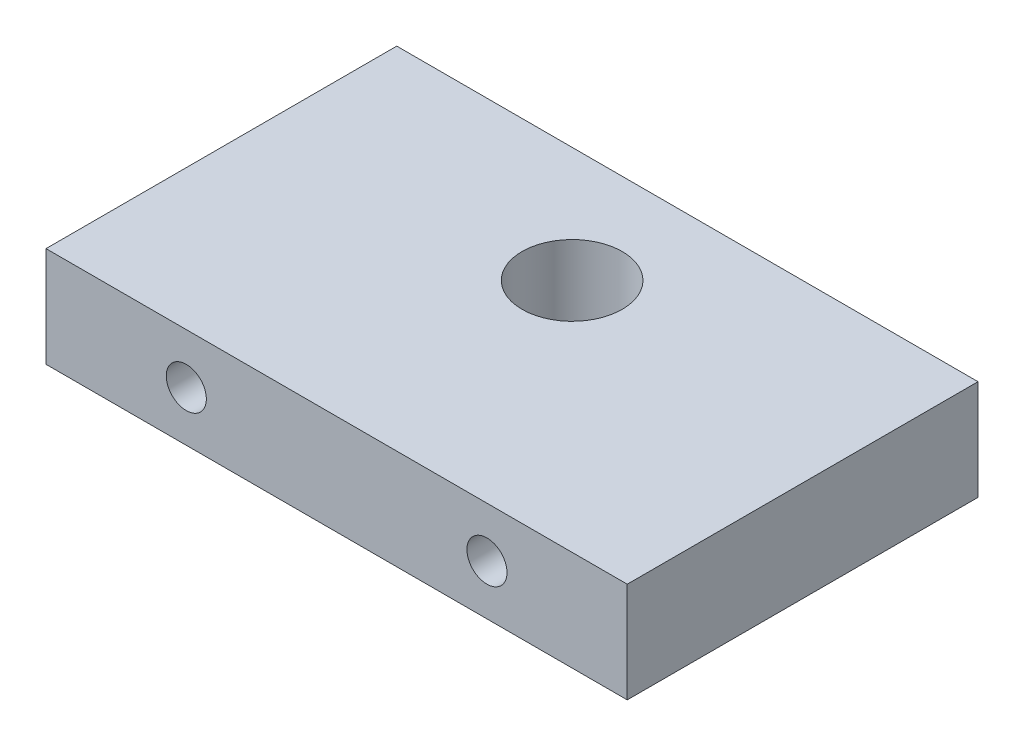
ISO-10303-21;
HEADER;
FILE_DESCRIPTION(('STEP AP214'),'2;1');
FILE_NAME('part.step','',(''),(''),'','','');
FILE_SCHEMA(('AUTOMOTIVE_DESIGN { 1 0 10303 214 1 1 1 1 }'));
ENDSEC;
DATA;
#1=APPLICATION_CONTEXT('core data for automotive mechanical design processes');
#2=APPLICATION_PROTOCOL_DEFINITION('international standard','automotive_design',2000,#1);
#3=PRODUCT_CONTEXT('',#1,'mechanical');
#4=PRODUCT('Part','Part','',(#3));
#5=PRODUCT_RELATED_PRODUCT_CATEGORY('part','',(#4));
#6=PRODUCT_DEFINITION_FORMATION('','',#4);
#7=PRODUCT_DEFINITION_CONTEXT('part definition',#1,'design');
#8=PRODUCT_DEFINITION('design','',#6,#7);
#9=PRODUCT_DEFINITION_SHAPE('','',#8);
#10=(LENGTH_UNIT() NAMED_UNIT(*) SI_UNIT(.MILLI.,.METRE.));
#11=(NAMED_UNIT(*) PLANE_ANGLE_UNIT() SI_UNIT($,.RADIAN.));
#12=(NAMED_UNIT(*) SI_UNIT($,.STERADIAN.) SOLID_ANGLE_UNIT());
#13=UNCERTAINTY_MEASURE_WITH_UNIT(LENGTH_MEASURE(1.E-05),#10,'distance_accuracy_value','');
#14=(GEOMETRIC_REPRESENTATION_CONTEXT(3) GLOBAL_UNCERTAINTY_ASSIGNED_CONTEXT((#13)) GLOBAL_UNIT_ASSIGNED_CONTEXT((#10,
#11,#12)) REPRESENTATION_CONTEXT('',''));
#15=CARTESIAN_POINT('',(0.,0.,0.));
#16=DIRECTION('',(0.,0.,1.));
#17=DIRECTION('',(1.,0.,0.));
#18=AXIS2_PLACEMENT_3D('',#15,#16,#17);
#19=CARTESIAN_POINT('',(0.,0.,45.));
#20=DIRECTION('',(1.,0.,0.));
#21=DIRECTION('',(0.,1.,0.));
#22=AXIS2_PLACEMENT_3D('',#19,#20,#21);
#23=PLANE('',#22);
#24=DIRECTION('',(0.,1.,0.));
#25=VECTOR('',#24,1.);
#26=CARTESIAN_POINT('',(0.,-10.,10.));
#27=LINE('',#26,#25);
#28=CARTESIAN_POINT('',(0.,-10.,10.));
#29=VERTEX_POINT('',#28);
#30=CARTESIAN_POINT('',(0.,0.,10.));
#31=VERTEX_POINT('',#30);
#32=EDGE_CURVE('E50',#29,#31,#27,.T.);
#33=ORIENTED_EDGE('',*,*,#32,.F.);
#34=DIRECTION('',(0.,0.,-1.));
#35=VECTOR('',#34,1.);
#36=CARTESIAN_POINT('',(0.,-10.,45.));
#37=LINE('',#36,#35);
#38=CARTESIAN_POINT('',(0.,-10.,45.));
#39=VERTEX_POINT('',#38);
#40=EDGE_CURVE('E11',#39,#29,#37,.T.);
#41=ORIENTED_EDGE('',*,*,#40,.F.);
#42=DIRECTION('',(0.,-1.,0.));
#43=VECTOR('',#42,1.);
#44=CARTESIAN_POINT('',(0.,0.,45.));
#45=LINE('',#44,#43);
#46=CARTESIAN_POINT('',(0.,0.,45.));
#47=VERTEX_POINT('',#46);
#48=EDGE_CURVE('E95',#47,#39,#45,.T.);
#49=ORIENTED_EDGE('',*,*,#48,.F.);
#50=DIRECTION('',(0.,0.,-1.));
#51=VECTOR('',#50,1.);
#52=CARTESIAN_POINT('',(0.,0.,45.));
#53=LINE('',#52,#51);
#54=EDGE_CURVE('E88',#47,#31,#53,.T.);
#55=ORIENTED_EDGE('',*,*,#54,.T.);
#56=EDGE_LOOP('',(#33,#41,#49,#55));
#57=FACE_BOUND('',#56,.T.);
#58=ADVANCED_FACE('F35',(#57),#23,.F.);
#59=CARTESIAN_POINT('',(0.,-10.,45.));
#60=DIRECTION('',(0.,1.,0.));
#61=DIRECTION('',(0.,0.,1.));
#62=AXIS2_PLACEMENT_3D('',#59,#60,#61);
#63=PLANE('',#62);
#64=CARTESIAN_POINT('',(29.,-10.,21.5));
#65=DIRECTION('',(0.,1.,0.));
#66=DIRECTION('',(0.,0.,1.));
#67=AXIS2_PLACEMENT_3D('',#64,#65,#66);
#68=CIRCLE('',#67,5.);
#69=CARTESIAN_POINT('',(29.,-10.,26.5));
#70=VERTEX_POINT('',#69);
#71=EDGE_CURVE('E82',#70,#70,#68,.T.);
#72=ORIENTED_EDGE('',*,*,#71,.T.);
#73=EDGE_LOOP('',(#72));
#74=FACE_BOUND('',#73,.T.);
#75=DIRECTION('',(-1.,0.,0.));
#76=VECTOR('',#75,1.);
#77=CARTESIAN_POINT('',(58.,-10.,10.));
#78=LINE('',#77,#76);
#79=CARTESIAN_POINT('',(58.,-10.,10.));
#80=VERTEX_POINT('',#79);
#81=EDGE_CURVE('E75',#80,#29,#78,.T.);
#82=ORIENTED_EDGE('',*,*,#81,.F.);
#83=DIRECTION('',(0.,0.,-1.));
#84=VECTOR('',#83,1.);
#85=CARTESIAN_POINT('',(58.,-10.,45.));
#86=LINE('',#85,#84);
#87=CARTESIAN_POINT('',(58.,-10.,45.));
#88=VERTEX_POINT('',#87);
#89=EDGE_CURVE('E43',#88,#80,#86,.T.);
#90=ORIENTED_EDGE('',*,*,#89,.F.);
#91=DIRECTION('',(1.,0.,0.));
#92=VECTOR('',#91,1.);
#93=CARTESIAN_POINT('',(0.,-10.,45.));
#94=LINE('',#93,#92);
#95=EDGE_CURVE('E92',#39,#88,#94,.T.);
#96=ORIENTED_EDGE('',*,*,#95,.F.);
#97=ORIENTED_EDGE('',*,*,#40,.T.);
#98=EDGE_LOOP('',(#82,#90,#96,#97));
#99=FACE_BOUND('',#98,.T.);
#100=ADVANCED_FACE('F91',(#74,#99),#63,.F.);
#101=CARTESIAN_POINT('',(58.,0.,45.));
#102=DIRECTION('',(-1.,0.,0.));
#103=DIRECTION('',(0.,-1.,0.));
#104=AXIS2_PLACEMENT_3D('',#101,#102,#103);
#105=PLANE('',#104);
#106=DIRECTION('',(0.,-1.,0.));
#107=VECTOR('',#106,1.);
#108=CARTESIAN_POINT('',(58.,0.,10.));
#109=LINE('',#108,#107);
#110=CARTESIAN_POINT('',(58.,0.,10.));
#111=VERTEX_POINT('',#110);
#112=EDGE_CURVE('E78',#111,#80,#109,.T.);
#113=ORIENTED_EDGE('',*,*,#112,.F.);
#114=DIRECTION('',(0.,0.,-1.));
#115=VECTOR('',#114,1.);
#116=CARTESIAN_POINT('',(58.,0.,45.));
#117=LINE('',#116,#115);
#118=CARTESIAN_POINT('',(58.,0.,45.));
#119=VERTEX_POINT('',#118);
#120=EDGE_CURVE('E109',#119,#111,#117,.T.);
#121=ORIENTED_EDGE('',*,*,#120,.F.);
#122=DIRECTION('',(0.,1.,0.));
#123=VECTOR('',#122,1.);
#124=CARTESIAN_POINT('',(58.,0.,45.));
#125=LINE('',#124,#123);
#126=EDGE_CURVE('E94',#88,#119,#125,.T.);
#127=ORIENTED_EDGE('',*,*,#126,.F.);
#128=ORIENTED_EDGE('',*,*,#89,.T.);
#129=EDGE_LOOP('',(#113,#121,#127,#128));
#130=FACE_BOUND('',#129,.T.);
#131=ADVANCED_FACE('F113',(#130),#105,.F.);
#132=CARTESIAN_POINT('',(0.,0.,45.));
#133=DIRECTION('',(0.,-1.,0.));
#134=DIRECTION('',(0.,0.,-1.));
#135=AXIS2_PLACEMENT_3D('',#132,#133,#134);
#136=PLANE('',#135);
#137=CARTESIAN_POINT('',(29.,0.,21.5));
#138=DIRECTION('',(0.,1.,0.));
#139=DIRECTION('',(0.,0.,1.));
#140=AXIS2_PLACEMENT_3D('',#137,#138,#139);
#141=CIRCLE('',#140,5.);
#142=CARTESIAN_POINT('',(29.,0.,26.5));
#143=VERTEX_POINT('',#142);
#144=EDGE_CURVE('E160',#143,#143,#141,.T.);
#145=ORIENTED_EDGE('',*,*,#144,.F.);
#146=EDGE_LOOP('',(#145));
#147=FACE_BOUND('',#146,.T.);
#148=DIRECTION('',(1.,0.,0.));
#149=VECTOR('',#148,1.);
#150=CARTESIAN_POINT('',(0.,0.,10.));
#151=LINE('',#150,#149);
#152=EDGE_CURVE('E89',#31,#111,#151,.T.);
#153=ORIENTED_EDGE('',*,*,#152,.F.);
#154=ORIENTED_EDGE('',*,*,#54,.F.);
#155=DIRECTION('',(-1.,0.,0.));
#156=VECTOR('',#155,1.);
#157=CARTESIAN_POINT('',(0.,0.,45.));
#158=LINE('',#157,#156);
#159=EDGE_CURVE('E58',#119,#47,#158,.T.);
#160=ORIENTED_EDGE('',*,*,#159,.F.);
#161=ORIENTED_EDGE('',*,*,#120,.T.);
#162=EDGE_LOOP('',(#153,#154,#160,#161));
#163=FACE_BOUND('',#162,.T.);
#164=ADVANCED_FACE('F116',(#147,#163),#136,.F.);
#165=CARTESIAN_POINT('',(14.,-5.,45.));
#166=DIRECTION('',(0.,0.,-1.));
#167=DIRECTION('',(-1.,0.,0.));
#168=AXIS2_PLACEMENT_3D('',#165,#166,#167);
#169=CYLINDRICAL_SURFACE('',#168,2.);
#170=CARTESIAN_POINT('',(14.,-5.,45.));
#171=DIRECTION('',(0.,0.,1.));
#172=DIRECTION('',(1.,0.,0.));
#173=AXIS2_PLACEMENT_3D('',#170,#171,#172);
#174=CIRCLE('',#173,2.);
#175=CARTESIAN_POINT('',(12.,-5.,45.));
#176=VERTEX_POINT('',#175);
#177=EDGE_CURVE('E99',#176,#176,#174,.T.);
#178=CARTESIAN_POINT('',(14.,-5.,10.));
#179=DIRECTION('',(0.,0.,-1.));
#180=DIRECTION('',(-1.,0.,0.));
#181=AXIS2_PLACEMENT_3D('',#178,#179,#180);
#182=CIRCLE('',#181,2.);
#183=CARTESIAN_POINT('',(12.,-5.,10.));
#184=VERTEX_POINT('',#183);
#185=EDGE_CURVE('E120',#184,#184,#182,.T.);
#186=CARTESIAN_POINT('',(12.,-5.,45.));
#187=CARTESIAN_POINT('',(12.,-5.,44.6354166666667));
#188=CARTESIAN_POINT('',(12.,-5.,44.2708333333333));
#189=CARTESIAN_POINT('',(12.,-5.,43.5416666666667));
#190=CARTESIAN_POINT('',(12.,-5.,43.1770833333333));
#191=CARTESIAN_POINT('',(12.,-5.,42.4479166666667));
#192=CARTESIAN_POINT('',(12.,-5.,42.0833333333333));
#193=CARTESIAN_POINT('',(12.,-5.,41.3541666666667));
#194=CARTESIAN_POINT('',(12.,-5.,40.9895833333333));
#195=CARTESIAN_POINT('',(12.,-5.,40.2604166666667));
#196=CARTESIAN_POINT('',(12.,-5.,39.8958333333333));
#197=CARTESIAN_POINT('',(12.,-5.,39.1666666666667));
#198=CARTESIAN_POINT('',(12.,-5.,38.8020833333333));
#199=CARTESIAN_POINT('',(12.,-5.,38.0729166666667));
#200=CARTESIAN_POINT('',(12.,-5.,37.7083333333333));
#201=CARTESIAN_POINT('',(12.,-5.,36.9791666666667));
#202=CARTESIAN_POINT('',(12.,-5.,36.6145833333333));
#203=CARTESIAN_POINT('',(12.,-5.,35.8854166666667));
#204=CARTESIAN_POINT('',(12.,-5.,35.5208333333333));
#205=CARTESIAN_POINT('',(12.,-5.,34.7916666666667));
#206=CARTESIAN_POINT('',(12.,-5.,34.4270833333333));
#207=CARTESIAN_POINT('',(12.,-5.,33.6979166666667));
#208=CARTESIAN_POINT('',(12.,-5.,33.3333333333333));
#209=CARTESIAN_POINT('',(12.,-5.,32.6041666666667));
#210=CARTESIAN_POINT('',(12.,-5.,32.2395833333333));
#211=CARTESIAN_POINT('',(12.,-5.,31.5104166666667));
#212=CARTESIAN_POINT('',(12.,-5.,31.1458333333333));
#213=CARTESIAN_POINT('',(12.,-5.,30.4166666666667));
#214=CARTESIAN_POINT('',(12.,-5.,30.0520833333333));
#215=CARTESIAN_POINT('',(12.,-5.,29.3229166666667));
#216=CARTESIAN_POINT('',(12.,-5.,28.9583333333333));
#217=CARTESIAN_POINT('',(12.,-5.,28.2291666666667));
#218=CARTESIAN_POINT('',(12.,-5.,27.8645833333333));
#219=CARTESIAN_POINT('',(12.,-5.,27.1354166666667));
#220=CARTESIAN_POINT('',(12.,-5.,26.7708333333333));
#221=CARTESIAN_POINT('',(12.,-5.,26.0416666666667));
#222=CARTESIAN_POINT('',(12.,-5.,25.6770833333333));
#223=CARTESIAN_POINT('',(12.,-5.,24.9479166666667));
#224=CARTESIAN_POINT('',(12.,-5.,24.5833333333333));
#225=CARTESIAN_POINT('',(12.,-5.,23.8541666666667));
#226=CARTESIAN_POINT('',(12.,-5.,23.4895833333333));
#227=CARTESIAN_POINT('',(12.,-5.,22.7604166666667));
#228=CARTESIAN_POINT('',(12.,-5.,22.3958333333333));
#229=CARTESIAN_POINT('',(12.,-5.,21.6666666666667));
#230=CARTESIAN_POINT('',(12.,-5.,21.3020833333333));
#231=CARTESIAN_POINT('',(12.,-5.,20.5729166666667));
#232=CARTESIAN_POINT('',(12.,-5.,20.2083333333333));
#233=CARTESIAN_POINT('',(12.,-5.,19.4791666666667));
#234=CARTESIAN_POINT('',(12.,-5.,19.1145833333333));
#235=CARTESIAN_POINT('',(12.,-5.,18.3854166666667));
#236=CARTESIAN_POINT('',(12.,-5.,18.0208333333333));
#237=CARTESIAN_POINT('',(12.,-5.,17.2916666666667));
#238=CARTESIAN_POINT('',(12.,-5.,16.9270833333333));
#239=CARTESIAN_POINT('',(12.,-5.,16.1979166666667));
#240=CARTESIAN_POINT('',(12.,-5.,15.8333333333333));
#241=CARTESIAN_POINT('',(12.,-5.,15.1041666666667));
#242=CARTESIAN_POINT('',(12.,-5.,14.7395833333333));
#243=CARTESIAN_POINT('',(12.,-5.,14.0104166666667));
#244=CARTESIAN_POINT('',(12.,-5.,13.6458333333333));
#245=CARTESIAN_POINT('',(12.,-5.,12.9166666666667));
#246=CARTESIAN_POINT('',(12.,-5.,12.5520833333333));
#247=CARTESIAN_POINT('',(12.,-5.,11.8229166666667));
#248=CARTESIAN_POINT('',(12.,-5.,11.4583333333333));
#249=CARTESIAN_POINT('',(12.,-5.,10.7291666666667));
#250=CARTESIAN_POINT('',(12.,-5.,10.3645833333333));
#251=CARTESIAN_POINT('',(12.,-5.,10.));
#252=B_SPLINE_CURVE_WITH_KNOTS('',3,(#186,#187,#188,#189,#190,#191,#192,#193,#194,#195,#196,
#197,#198,#199,#200,#201,#202,#203,#204,#205,#206,#207,#208,#209,#210,#211,#212,#213,#214,#215,
#216,#217,#218,#219,#220,#221,#222,#223,#224,#225,#226,#227,#228,#229,#230,#231,#232,#233,#234,
#235,#236,#237,#238,#239,#240,#241,#242,#243,#244,#245,#246,#247,#248,#249,#250,#251),
.UNSPECIFIED.,.F.,.F.,(4,2,2,2,2,2,2,2,2,2,2,2,2,2,2,2,2,2,2,2,2,2,2,2,2,2,2,2,2,2,2,2,4),(0.,
1.09375,2.1875,3.28124999999999,4.375,5.46874999999999,6.56249999999999,7.65625,
8.74999999999999,9.84374999999999,10.9375,12.03125,13.125,14.21875,15.3125,16.40625,17.5,
18.59375,19.6875,20.78125,21.875,22.96875,24.0625,25.15625,26.25,27.34375,28.4375,29.53125,
30.625,31.71875,32.8125,33.90625,35.),.UNSPECIFIED.);
#253=EDGE_CURVE('BSEAM137',#176,#184,#252,.T.);
#254=ORIENTED_EDGE('',*,*,#177,.T.);
#255=ORIENTED_EDGE('',*,*,#185,.T.);
#256=ORIENTED_EDGE('',*,*,#253,.T.);
#257=ORIENTED_EDGE('',*,*,#253,.F.);
#258=EDGE_LOOP('',(#254,#256,#255,#257));
#259=FACE_BOUND('',#258,.T.);
#260=ADVANCED_FACE('F137',(#259),#169,.F.);
#261=CARTESIAN_POINT('',(44.,-5.,45.));
#262=DIRECTION('',(0.,0.,-1.));
#263=DIRECTION('',(-1.,0.,0.));
#264=AXIS2_PLACEMENT_3D('',#261,#262,#263);
#265=CYLINDRICAL_SURFACE('',#264,2.);
#266=CARTESIAN_POINT('',(44.,-5.,45.));
#267=DIRECTION('',(0.,0.,1.));
#268=DIRECTION('',(1.,0.,0.));
#269=AXIS2_PLACEMENT_3D('',#266,#267,#268);
#270=CIRCLE('',#269,2.);
#271=CARTESIAN_POINT('',(42.,-5.,45.));
#272=VERTEX_POINT('',#271);
#273=EDGE_CURVE('E102',#272,#272,#270,.T.);
#274=CARTESIAN_POINT('',(44.,-5.,10.));
#275=DIRECTION('',(0.,0.,-1.));
#276=DIRECTION('',(-1.,0.,0.));
#277=AXIS2_PLACEMENT_3D('',#274,#275,#276);
#278=CIRCLE('',#277,2.);
#279=CARTESIAN_POINT('',(42.,-5.,10.));
#280=VERTEX_POINT('',#279);
#281=EDGE_CURVE('E38',#280,#280,#278,.T.);
#282=CARTESIAN_POINT('',(42.,-5.,45.));
#283=CARTESIAN_POINT('',(42.,-5.,44.6354166666667));
#284=CARTESIAN_POINT('',(42.,-5.,44.2708333333333));
#285=CARTESIAN_POINT('',(42.,-5.,43.5416666666667));
#286=CARTESIAN_POINT('',(42.,-5.,43.1770833333333));
#287=CARTESIAN_POINT('',(42.,-5.,42.4479166666667));
#288=CARTESIAN_POINT('',(42.,-5.,42.0833333333333));
#289=CARTESIAN_POINT('',(42.,-5.,41.3541666666667));
#290=CARTESIAN_POINT('',(42.,-5.,40.9895833333333));
#291=CARTESIAN_POINT('',(42.,-5.,40.2604166666667));
#292=CARTESIAN_POINT('',(42.,-5.,39.8958333333333));
#293=CARTESIAN_POINT('',(42.,-5.,39.1666666666667));
#294=CARTESIAN_POINT('',(42.,-5.,38.8020833333333));
#295=CARTESIAN_POINT('',(42.,-5.,38.0729166666667));
#296=CARTESIAN_POINT('',(42.,-5.,37.7083333333333));
#297=CARTESIAN_POINT('',(42.,-5.,36.9791666666667));
#298=CARTESIAN_POINT('',(42.,-5.,36.6145833333333));
#299=CARTESIAN_POINT('',(42.,-5.,35.8854166666667));
#300=CARTESIAN_POINT('',(42.,-5.,35.5208333333333));
#301=CARTESIAN_POINT('',(42.,-5.,34.7916666666667));
#302=CARTESIAN_POINT('',(42.,-5.,34.4270833333333));
#303=CARTESIAN_POINT('',(42.,-5.,33.6979166666667));
#304=CARTESIAN_POINT('',(42.,-5.,33.3333333333333));
#305=CARTESIAN_POINT('',(42.,-5.,32.6041666666667));
#306=CARTESIAN_POINT('',(42.,-5.,32.2395833333333));
#307=CARTESIAN_POINT('',(42.,-5.,31.5104166666667));
#308=CARTESIAN_POINT('',(42.,-5.,31.1458333333333));
#309=CARTESIAN_POINT('',(42.,-5.,30.4166666666667));
#310=CARTESIAN_POINT('',(42.,-5.,30.0520833333333));
#311=CARTESIAN_POINT('',(42.,-5.,29.3229166666667));
#312=CARTESIAN_POINT('',(42.,-5.,28.9583333333333));
#313=CARTESIAN_POINT('',(42.,-5.,28.2291666666667));
#314=CARTESIAN_POINT('',(42.,-5.,27.8645833333333));
#315=CARTESIAN_POINT('',(42.,-5.,27.1354166666667));
#316=CARTESIAN_POINT('',(42.,-5.,26.7708333333333));
#317=CARTESIAN_POINT('',(42.,-5.,26.0416666666667));
#318=CARTESIAN_POINT('',(42.,-5.,25.6770833333333));
#319=CARTESIAN_POINT('',(42.,-5.,24.9479166666667));
#320=CARTESIAN_POINT('',(42.,-5.,24.5833333333333));
#321=CARTESIAN_POINT('',(42.,-5.,23.8541666666667));
#322=CARTESIAN_POINT('',(42.,-5.,23.4895833333333));
#323=CARTESIAN_POINT('',(42.,-5.,22.7604166666667));
#324=CARTESIAN_POINT('',(42.,-5.,22.3958333333333));
#325=CARTESIAN_POINT('',(42.,-5.,21.6666666666667));
#326=CARTESIAN_POINT('',(42.,-5.,21.3020833333333));
#327=CARTESIAN_POINT('',(42.,-5.,20.5729166666667));
#328=CARTESIAN_POINT('',(42.,-5.,20.2083333333333));
#329=CARTESIAN_POINT('',(42.,-5.,19.4791666666667));
#330=CARTESIAN_POINT('',(42.,-5.,19.1145833333333));
#331=CARTESIAN_POINT('',(42.,-5.,18.3854166666667));
#332=CARTESIAN_POINT('',(42.,-5.,18.0208333333333));
#333=CARTESIAN_POINT('',(42.,-5.,17.2916666666667));
#334=CARTESIAN_POINT('',(42.,-5.,16.9270833333333));
#335=CARTESIAN_POINT('',(42.,-5.,16.1979166666667));
#336=CARTESIAN_POINT('',(42.,-5.,15.8333333333333));
#337=CARTESIAN_POINT('',(42.,-5.,15.1041666666667));
#338=CARTESIAN_POINT('',(42.,-5.,14.7395833333333));
#339=CARTESIAN_POINT('',(42.,-5.,14.0104166666667));
#340=CARTESIAN_POINT('',(42.,-5.,13.6458333333333));
#341=CARTESIAN_POINT('',(42.,-5.,12.9166666666667));
#342=CARTESIAN_POINT('',(42.,-5.,12.5520833333333));
#343=CARTESIAN_POINT('',(42.,-5.,11.8229166666667));
#344=CARTESIAN_POINT('',(42.,-5.,11.4583333333333));
#345=CARTESIAN_POINT('',(42.,-5.,10.7291666666667));
#346=CARTESIAN_POINT('',(42.,-5.,10.3645833333333));
#347=CARTESIAN_POINT('',(42.,-5.,10.));
#348=B_SPLINE_CURVE_WITH_KNOTS('',3,(#282,#283,#284,#285,#286,#287,#288,#289,#290,#291,#292,
#293,#294,#295,#296,#297,#298,#299,#300,#301,#302,#303,#304,#305,#306,#307,#308,#309,#310,#311,
#312,#313,#314,#315,#316,#317,#318,#319,#320,#321,#322,#323,#324,#325,#326,#327,#328,#329,#330,
#331,#332,#333,#334,#335,#336,#337,#338,#339,#340,#341,#342,#343,#344,#345,#346,#347),
.UNSPECIFIED.,.F.,.F.,(4,2,2,2,2,2,2,2,2,2,2,2,2,2,2,2,2,2,2,2,2,2,2,2,2,2,2,2,2,2,2,2,4),(0.,
1.09375,2.1875,3.28124999999999,4.375,5.46874999999999,6.56249999999999,7.65625,
8.74999999999999,9.84374999999999,10.9375,12.03125,13.125,14.21875,15.3125,16.40625,17.5,
18.59375,19.6875,20.78125,21.875,22.96875,24.0625,25.15625,26.25,27.34375,28.4375,29.53125,
30.625,31.71875,32.8125,33.90625,35.),.UNSPECIFIED.);
#349=EDGE_CURVE('BSEAM125',#272,#280,#348,.T.);
#350=ORIENTED_EDGE('',*,*,#273,.T.);
#351=ORIENTED_EDGE('',*,*,#281,.T.);
#352=ORIENTED_EDGE('',*,*,#349,.T.);
#353=ORIENTED_EDGE('',*,*,#349,.F.);
#354=EDGE_LOOP('',(#350,#352,#351,#353));
#355=FACE_BOUND('',#354,.T.);
#356=ADVANCED_FACE('F125',(#355),#265,.F.);
#357=CARTESIAN_POINT('',(0.,0.,45.));
#358=DIRECTION('',(0.,0.,1.));
#359=DIRECTION('',(1.,0.,0.));
#360=AXIS2_PLACEMENT_3D('',#357,#358,#359);
#361=PLANE('',#360);
#362=ORIENTED_EDGE('',*,*,#177,.F.);
#363=EDGE_LOOP('',(#362));
#364=FACE_BOUND('',#363,.T.);
#365=ORIENTED_EDGE('',*,*,#48,.T.);
#366=ORIENTED_EDGE('',*,*,#95,.T.);
#367=ORIENTED_EDGE('',*,*,#126,.T.);
#368=ORIENTED_EDGE('',*,*,#159,.T.);
#369=EDGE_LOOP('',(#365,#366,#367,#368));
#370=FACE_BOUND('',#369,.T.);
#371=ORIENTED_EDGE('',*,*,#273,.F.);
#372=EDGE_LOOP('',(#371));
#373=FACE_BOUND('',#372,.T.);
#374=ADVANCED_FACE('F97',(#364,#370,#373),#361,.T.);
#375=CARTESIAN_POINT('',(0.,0.,10.));
#376=DIRECTION('',(0.,0.,-1.));
#377=DIRECTION('',(-1.,0.,0.));
#378=AXIS2_PLACEMENT_3D('',#375,#376,#377);
#379=PLANE('',#378);
#380=ORIENTED_EDGE('',*,*,#185,.F.);
#381=EDGE_LOOP('',(#380));
#382=FACE_BOUND('',#381,.T.);
#383=ORIENTED_EDGE('',*,*,#281,.F.);
#384=EDGE_LOOP('',(#383));
#385=FACE_BOUND('',#384,.T.);
#386=ORIENTED_EDGE('',*,*,#81,.T.);
#387=ORIENTED_EDGE('',*,*,#32,.T.);
#388=ORIENTED_EDGE('',*,*,#152,.T.);
#389=ORIENTED_EDGE('',*,*,#112,.T.);
#390=EDGE_LOOP('',(#386,#387,#388,#389));
#391=FACE_BOUND('',#390,.T.);
#392=ADVANCED_FACE('F76',(#382,#385,#391),#379,.T.);
#393=CARTESIAN_POINT('',(29.,-10.,21.5));
#394=DIRECTION('',(0.,1.,0.));
#395=DIRECTION('',(0.,0.,1.));
#396=AXIS2_PLACEMENT_3D('',#393,#394,#395);
#397=CYLINDRICAL_SURFACE('',#396,5.);
#398=ORIENTED_EDGE('',*,*,#71,.F.);
#399=EDGE_LOOP('',(#398));
#400=FACE_BOUND('',#399,.T.);
#401=ORIENTED_EDGE('',*,*,#144,.T.);
#402=EDGE_LOOP('',(#401));
#403=FACE_BOUND('',#402,.T.);
#404=ADVANCED_FACE('F134',(#400,#403),#397,.F.);
#405=CLOSED_SHELL('',(#58,#100,#131,#164,#260,#356,#374,#392,#404));
#406=MANIFOLD_SOLID_BREP('B2',#405);
#407=ADVANCED_BREP_SHAPE_REPRESENTATION('',(#18,#406),#14);
#408=SHAPE_DEFINITION_REPRESENTATION(#9,#407);
ENDSEC;
END-ISO-10303-21;
